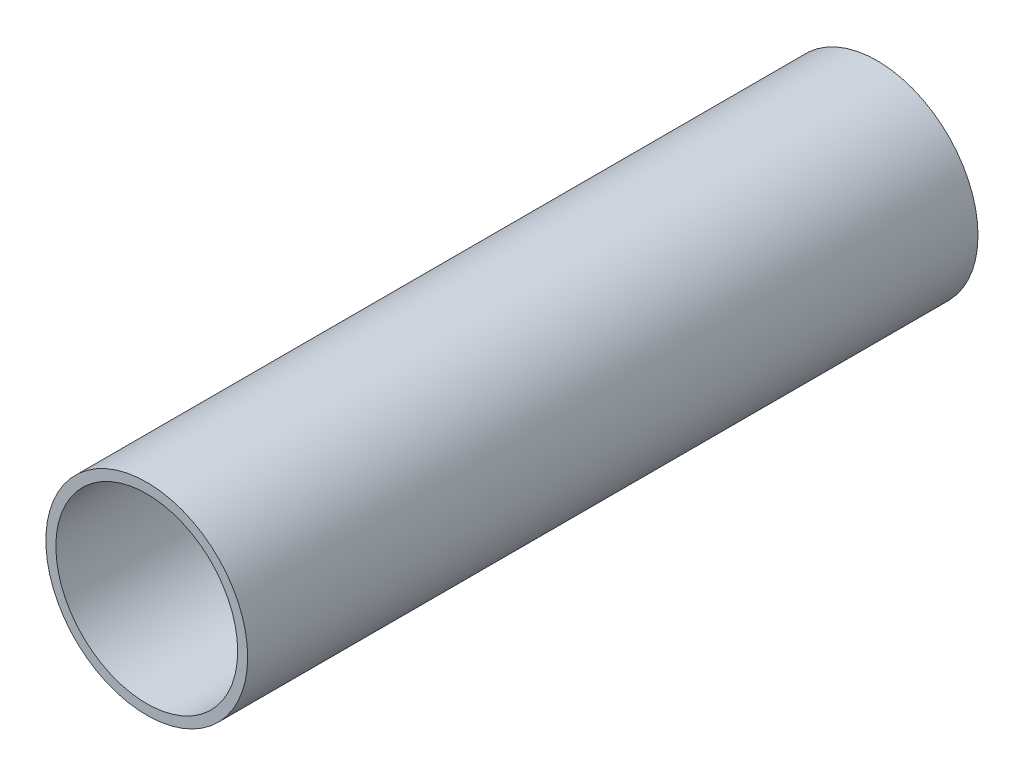
ISO-10303-21;
HEADER;
FILE_DESCRIPTION(('STEP AP214'),'2;1');
FILE_NAME('part.step','',(''),(''),'','','');
FILE_SCHEMA(('AUTOMOTIVE_DESIGN { 1 0 10303 214 1 1 1 1 }'));
ENDSEC;
DATA;
#1=APPLICATION_CONTEXT('core data for automotive mechanical design processes');
#2=APPLICATION_PROTOCOL_DEFINITION('international standard','automotive_design',2000,#1);
#3=PRODUCT_CONTEXT('',#1,'mechanical');
#4=PRODUCT('Part','Part','',(#3));
#5=PRODUCT_RELATED_PRODUCT_CATEGORY('part','',(#4));
#6=PRODUCT_DEFINITION_FORMATION('','',#4);
#7=PRODUCT_DEFINITION_CONTEXT('part definition',#1,'design');
#8=PRODUCT_DEFINITION('design','',#6,#7);
#9=PRODUCT_DEFINITION_SHAPE('','',#8);
#10=(LENGTH_UNIT() NAMED_UNIT(*) SI_UNIT(.MILLI.,.METRE.));
#11=(NAMED_UNIT(*) PLANE_ANGLE_UNIT() SI_UNIT($,.RADIAN.));
#12=(NAMED_UNIT(*) SI_UNIT($,.STERADIAN.) SOLID_ANGLE_UNIT());
#13=UNCERTAINTY_MEASURE_WITH_UNIT(LENGTH_MEASURE(1.E-05),#10,'distance_accuracy_value','');
#14=(GEOMETRIC_REPRESENTATION_CONTEXT(3) GLOBAL_UNCERTAINTY_ASSIGNED_CONTEXT((#13)) GLOBAL_UNIT_ASSIGNED_CONTEXT((#10,
#11,#12)) REPRESENTATION_CONTEXT('',''));
#15=CARTESIAN_POINT('',(0.,0.,0.));
#16=DIRECTION('',(0.,0.,1.));
#17=DIRECTION('',(1.,0.,0.));
#18=AXIS2_PLACEMENT_3D('',#15,#16,#17);
#19=CARTESIAN_POINT('',(0.,0.,306.07));
#20=DIRECTION('',(0.,0.,-1.));
#21=DIRECTION('',(-1.,0.,0.));
#22=AXIS2_PLACEMENT_3D('',#19,#20,#21);
#23=CYLINDRICAL_SURFACE('',#22,84.582);
#24=CARTESIAN_POINT('',(0.,0.,306.07));
#25=DIRECTION('',(0.,0.,1.));
#26=DIRECTION('',(1.,0.,0.));
#27=AXIS2_PLACEMENT_3D('',#24,#25,#26);
#28=CIRCLE('',#27,84.582);
#29=CARTESIAN_POINT('',(84.582,0.,306.07));
#30=VERTEX_POINT('',#29);
#31=EDGE_CURVE('E10',#30,#30,#28,.T.);
#32=ORIENTED_EDGE('',*,*,#31,.F.);
#33=EDGE_LOOP('',(#32));
#34=FACE_BOUND('',#33,.T.);
#35=CARTESIAN_POINT('',(0.,0.,-306.07));
#36=DIRECTION('',(0.,0.,1.));
#37=DIRECTION('',(1.,0.,0.));
#38=AXIS2_PLACEMENT_3D('',#35,#36,#37);
#39=CIRCLE('',#38,84.582);
#40=CARTESIAN_POINT('',(84.582,0.,-306.07));
#41=VERTEX_POINT('',#40);
#42=EDGE_CURVE('E34',#41,#41,#39,.T.);
#43=ORIENTED_EDGE('',*,*,#42,.T.);
#44=EDGE_LOOP('',(#43));
#45=FACE_BOUND('',#44,.T.);
#46=ADVANCED_FACE('F31',(#34,#45),#23,.T.);
#47=CARTESIAN_POINT('',(0.,0.,306.07));
#48=DIRECTION('',(0.,0.,1.));
#49=DIRECTION('',(1.,0.,0.));
#50=AXIS2_PLACEMENT_3D('',#47,#48,#49);
#51=PLANE('',#50);
#52=CARTESIAN_POINT('',(0.,0.,306.07));
#53=DIRECTION('',(0.,0.,1.));
#54=DIRECTION('',(1.,0.,0.));
#55=AXIS2_PLACEMENT_3D('',#52,#53,#54);
#56=CIRCLE('',#55,76.2);
#57=CARTESIAN_POINT('',(76.2,0.,306.07));
#58=VERTEX_POINT('',#57);
#59=EDGE_CURVE('E45',#58,#58,#56,.T.);
#60=ORIENTED_EDGE('',*,*,#59,.F.);
#61=EDGE_LOOP('',(#60));
#62=FACE_BOUND('',#61,.T.);
#63=ORIENTED_EDGE('',*,*,#31,.T.);
#64=EDGE_LOOP('',(#63));
#65=FACE_BOUND('',#64,.T.);
#66=ADVANCED_FACE('F51',(#62,#65),#51,.T.);
#67=CARTESIAN_POINT('',(0.,0.,-306.07));
#68=DIRECTION('',(0.,0.,1.));
#69=DIRECTION('',(1.,0.,0.));
#70=AXIS2_PLACEMENT_3D('',#67,#68,#69);
#71=PLANE('',#70);
#72=CARTESIAN_POINT('',(0.,0.,-306.07));
#73=DIRECTION('',(0.,0.,1.));
#74=DIRECTION('',(1.,0.,0.));
#75=AXIS2_PLACEMENT_3D('',#72,#73,#74);
#76=CIRCLE('',#75,76.2);
#77=CARTESIAN_POINT('',(76.2,0.,-306.07));
#78=VERTEX_POINT('',#77);
#79=EDGE_CURVE('E41',#78,#78,#76,.F.);
#80=ORIENTED_EDGE('',*,*,#79,.F.);
#81=EDGE_LOOP('',(#80));
#82=FACE_BOUND('',#81,.T.);
#83=ORIENTED_EDGE('',*,*,#42,.F.);
#84=EDGE_LOOP('',(#83));
#85=FACE_BOUND('',#84,.T.);
#86=ADVANCED_FACE('F53',(#82,#85),#71,.F.);
#87=CARTESIAN_POINT('',(0.,0.,-521.59614690566));
#88=DIRECTION('',(0.,0.,1.));
#89=DIRECTION('',(1.,0.,0.));
#90=AXIS2_PLACEMENT_3D('',#87,#88,#89);
#91=CYLINDRICAL_SURFACE('',#90,76.2);
#92=CARTESIAN_POINT('',(76.2,0.,-306.07));
#93=CARTESIAN_POINT('',(76.2,0.,-299.693541666667));
#94=CARTESIAN_POINT('',(76.2,0.,-293.317083333333));
#95=CARTESIAN_POINT('',(76.2,0.,-280.564166666667));
#96=CARTESIAN_POINT('',(76.2,0.,-274.187708333333));
#97=CARTESIAN_POINT('',(76.2,0.,-261.434791666667));
#98=CARTESIAN_POINT('',(76.2,0.,-255.058333333333));
#99=CARTESIAN_POINT('',(76.2,0.,-242.305416666667));
#100=CARTESIAN_POINT('',(76.2,0.,-235.928958333333));
#101=CARTESIAN_POINT('',(76.2,0.,-223.176041666667));
#102=CARTESIAN_POINT('',(76.2,0.,-216.799583333333));
#103=CARTESIAN_POINT('',(76.2,0.,-204.046666666667));
#104=CARTESIAN_POINT('',(76.2,0.,-197.670208333333));
#105=CARTESIAN_POINT('',(76.2,0.,-184.917291666667));
#106=CARTESIAN_POINT('',(76.2,0.,-178.540833333333));
#107=CARTESIAN_POINT('',(76.2,0.,-165.787916666667));
#108=CARTESIAN_POINT('',(76.2,0.,-159.411458333333));
#109=CARTESIAN_POINT('',(76.2,0.,-146.658541666667));
#110=CARTESIAN_POINT('',(76.2,0.,-140.282083333333));
#111=CARTESIAN_POINT('',(76.2,0.,-127.529166666667));
#112=CARTESIAN_POINT('',(76.2,0.,-121.152708333333));
#113=CARTESIAN_POINT('',(76.2,0.,-108.399791666667));
#114=CARTESIAN_POINT('',(76.2,0.,-102.023333333333));
#115=CARTESIAN_POINT('',(76.2,0.,-89.2704166666667));
#116=CARTESIAN_POINT('',(76.2,0.,-82.8939583333334));
#117=CARTESIAN_POINT('',(76.2,0.,-70.1410416666667));
#118=CARTESIAN_POINT('',(76.2,0.,-63.7645833333334));
#119=CARTESIAN_POINT('',(76.2,0.,-51.0116666666667));
#120=CARTESIAN_POINT('',(76.2,0.,-44.6352083333334));
#121=CARTESIAN_POINT('',(76.2,0.,-31.8822916666667));
#122=CARTESIAN_POINT('',(76.2,0.,-25.5058333333334));
#123=CARTESIAN_POINT('',(76.2,0.,-12.7529166666668));
#124=CARTESIAN_POINT('',(76.2,0.,-6.37645833333345));
#125=CARTESIAN_POINT('',(76.2,0.,6.37645833333322));
#126=CARTESIAN_POINT('',(76.2,0.,12.7529166666666));
#127=CARTESIAN_POINT('',(76.2,0.,25.5058333333332));
#128=CARTESIAN_POINT('',(76.2,0.,31.8822916666666));
#129=CARTESIAN_POINT('',(76.2,0.,44.6352083333332));
#130=CARTESIAN_POINT('',(76.2,0.,51.0116666666666));
#131=CARTESIAN_POINT('',(76.2,0.,63.7645833333332));
#132=CARTESIAN_POINT('',(76.2,0.,70.1410416666666));
#133=CARTESIAN_POINT('',(76.2,0.,82.8939583333332));
#134=CARTESIAN_POINT('',(76.2,0.,89.2704166666666));
#135=CARTESIAN_POINT('',(76.2,0.,102.023333333333));
#136=CARTESIAN_POINT('',(76.2,0.,108.399791666667));
#137=CARTESIAN_POINT('',(76.2,0.,121.152708333333));
#138=CARTESIAN_POINT('',(76.2,0.,127.529166666667));
#139=CARTESIAN_POINT('',(76.2,0.,140.282083333333));
#140=CARTESIAN_POINT('',(76.2,0.,146.658541666667));
#141=CARTESIAN_POINT('',(76.2,0.,159.411458333333));
#142=CARTESIAN_POINT('',(76.2,0.,165.787916666667));
#143=CARTESIAN_POINT('',(76.2,0.,178.540833333333));
#144=CARTESIAN_POINT('',(76.2,0.,184.917291666667));
#145=CARTESIAN_POINT('',(76.2,0.,197.670208333333));
#146=CARTESIAN_POINT('',(76.2,0.,204.046666666666));
#147=CARTESIAN_POINT('',(76.2,0.,216.799583333333));
#148=CARTESIAN_POINT('',(76.2,0.,223.176041666666));
#149=CARTESIAN_POINT('',(76.2,0.,235.928958333333));
#150=CARTESIAN_POINT('',(76.2,0.,242.305416666667));
#151=CARTESIAN_POINT('',(76.2,0.,255.058333333333));
#152=CARTESIAN_POINT('',(76.2,0.,261.434791666667));
#153=CARTESIAN_POINT('',(76.2,0.,274.187708333333));
#154=CARTESIAN_POINT('',(76.2,0.,280.564166666666));
#155=CARTESIAN_POINT('',(76.2,0.,293.317083333333));
#156=CARTESIAN_POINT('',(76.2,0.,299.693541666667));
#157=CARTESIAN_POINT('',(76.2,0.,306.07));
#158=B_SPLINE_CURVE_WITH_KNOTS('',3,(#92,#93,#94,#95,#96,#97,#98,#99,#100,#101,#102,#103,#104,
#105,#106,#107,#108,#109,#110,#111,#112,#113,#114,#115,#116,#117,#118,#119,#120,#121,#122,#123,
#124,#125,#126,#127,#128,#129,#130,#131,#132,#133,#134,#135,#136,#137,#138,#139,#140,#141,#142,
#143,#144,#145,#146,#147,#148,#149,#150,#151,#152,#153,#154,#155,#156,#157),.UNSPECIFIED.,.F.,
.F.,(4,2,2,2,2,2,2,2,2,2,2,2,2,2,2,2,2,2,2,2,2,2,2,2,2,2,2,2,2,2,2,2,4),(0.,19.129375,
38.2587499999999,57.388125,76.5175,95.646875,114.77625,133.905625,153.035,172.164375,191.29375,
210.423125,229.5525,248.681875,267.81125,286.940625,306.07,325.199375,344.32875,363.458125,
382.5875,401.716875,420.84625,439.975625,459.105,478.234375,497.36375,516.493125,535.6225,
554.751875,573.88125,593.010625,612.14),.UNSPECIFIED.);
#159=EDGE_CURVE('BSEAM49',#78,#58,#158,.T.);
#160=ORIENTED_EDGE('',*,*,#79,.T.);
#161=ORIENTED_EDGE('',*,*,#59,.T.);
#162=ORIENTED_EDGE('',*,*,#159,.T.);
#163=ORIENTED_EDGE('',*,*,#159,.F.);
#164=EDGE_LOOP('',(#160,#162,#161,#163));
#165=FACE_BOUND('',#164,.T.);
#166=ADVANCED_FACE('F49',(#165),#91,.F.);
#167=CLOSED_SHELL('',(#46,#66,#86,#166));
#168=MANIFOLD_SOLID_BREP('B2',#167);
#169=ADVANCED_BREP_SHAPE_REPRESENTATION('',(#18,#168),#14);
#170=SHAPE_DEFINITION_REPRESENTATION(#9,#169);
ENDSEC;
END-ISO-10303-21;
